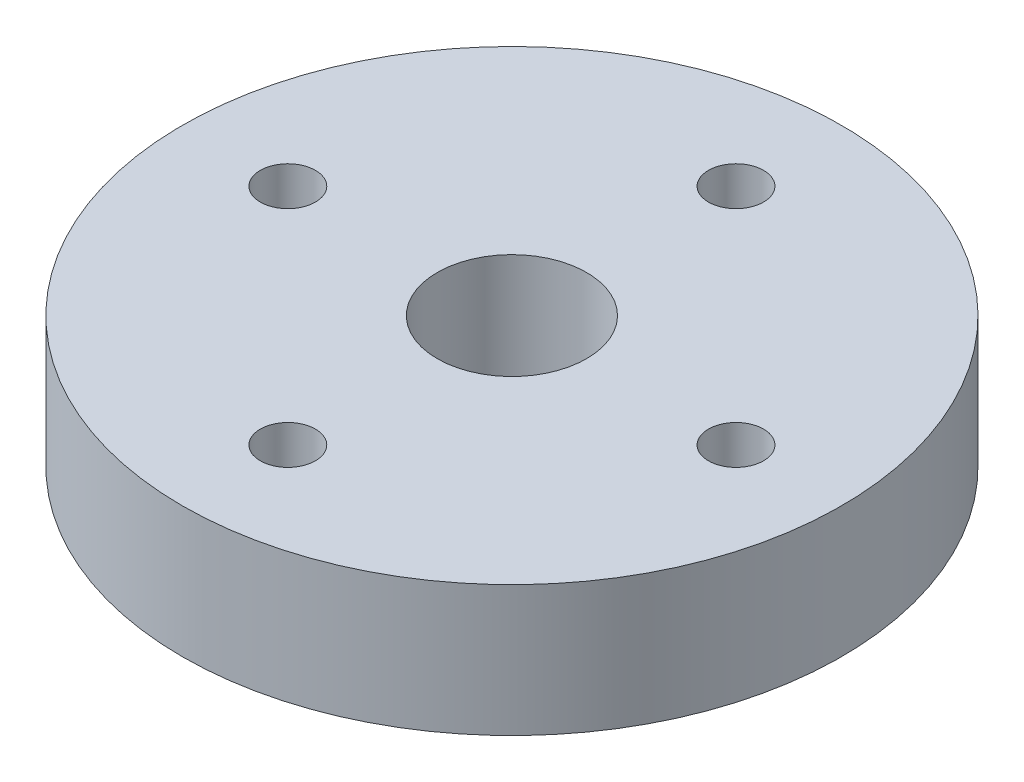
ISO-10303-21;
HEADER;
FILE_DESCRIPTION(('STEP AP214'),'2;1');
FILE_NAME('part.step','',(''),(''),'','','');
FILE_SCHEMA(('AUTOMOTIVE_DESIGN { 1 0 10303 214 1 1 1 1 }'));
ENDSEC;
DATA;
#1=APPLICATION_CONTEXT('core data for automotive mechanical design processes');
#2=APPLICATION_PROTOCOL_DEFINITION('international standard','automotive_design',2000,#1);
#3=PRODUCT_CONTEXT('',#1,'mechanical');
#4=PRODUCT('Part','Part','',(#3));
#5=PRODUCT_RELATED_PRODUCT_CATEGORY('part','',(#4));
#6=PRODUCT_DEFINITION_FORMATION('','',#4);
#7=PRODUCT_DEFINITION_CONTEXT('part definition',#1,'design');
#8=PRODUCT_DEFINITION('design','',#6,#7);
#9=PRODUCT_DEFINITION_SHAPE('','',#8);
#10=(LENGTH_UNIT() NAMED_UNIT(*) SI_UNIT(.MILLI.,.METRE.));
#11=(NAMED_UNIT(*) PLANE_ANGLE_UNIT() SI_UNIT($,.RADIAN.));
#12=(NAMED_UNIT(*) SI_UNIT($,.STERADIAN.) SOLID_ANGLE_UNIT());
#13=UNCERTAINTY_MEASURE_WITH_UNIT(LENGTH_MEASURE(1.E-05),#10,'distance_accuracy_value','');
#14=(GEOMETRIC_REPRESENTATION_CONTEXT(3) GLOBAL_UNCERTAINTY_ASSIGNED_CONTEXT((#13)) GLOBAL_UNIT_ASSIGNED_CONTEXT((#10,
#11,#12)) REPRESENTATION_CONTEXT('',''));
#15=CARTESIAN_POINT('',(0.,0.,0.));
#16=DIRECTION('',(0.,0.,1.));
#17=DIRECTION('',(1.,0.,0.));
#18=AXIS2_PLACEMENT_3D('',#15,#16,#17);
#19=CARTESIAN_POINT('',(0.,7.,0.));
#20=DIRECTION('',(0.,1.,0.));
#21=DIRECTION('',(0.,0.,1.));
#22=AXIS2_PLACEMENT_3D('',#19,#20,#21);
#23=PLANE('',#22);
#24=CARTESIAN_POINT('',(12.,7.,0.));
#25=DIRECTION('',(0.,1.,0.));
#26=DIRECTION('',(0.,0.,-1.));
#27=AXIS2_PLACEMENT_3D('',#24,#25,#26);
#28=CIRCLE('',#27,1.475);
#29=CARTESIAN_POINT('',(12.,7.,-1.475));
#30=VERTEX_POINT('',#29);
#31=EDGE_CURVE('E75',#30,#30,#28,.T.);
#32=ORIENTED_EDGE('',*,*,#31,.F.);
#33=EDGE_LOOP('',(#32));
#34=FACE_BOUND('',#33,.T.);
#35=CARTESIAN_POINT('',(0.,7.,-12.));
#36=DIRECTION('',(0.,1.,0.));
#37=DIRECTION('',(0.,0.,1.));
#38=AXIS2_PLACEMENT_3D('',#35,#36,#37);
#39=CIRCLE('',#38,1.475);
#40=CARTESIAN_POINT('',(0.,7.,-10.525));
#41=VERTEX_POINT('',#40);
#42=EDGE_CURVE('E68',#41,#41,#39,.T.);
#43=ORIENTED_EDGE('',*,*,#42,.F.);
#44=EDGE_LOOP('',(#43));
#45=FACE_BOUND('',#44,.T.);
#46=CARTESIAN_POINT('',(0.,7.,0.));
#47=DIRECTION('',(0.,1.,0.));
#48=DIRECTION('',(0.,0.,1.));
#49=AXIS2_PLACEMENT_3D('',#46,#47,#48);
#50=CIRCLE('',#49,17.65);
#51=CARTESIAN_POINT('',(0.,7.,17.65));
#52=VERTEX_POINT('',#51);
#53=EDGE_CURVE('E11',#52,#52,#50,.T.);
#54=ORIENTED_EDGE('',*,*,#53,.T.);
#55=EDGE_LOOP('',(#54));
#56=FACE_BOUND('',#55,.T.);
#57=CARTESIAN_POINT('',(0.,7.,0.));
#58=DIRECTION('',(0.,1.,0.));
#59=DIRECTION('',(0.,0.,1.));
#60=AXIS2_PLACEMENT_3D('',#57,#58,#59);
#61=CIRCLE('',#60,4.);
#62=CARTESIAN_POINT('',(0.,7.,4.));
#63=VERTEX_POINT('',#62);
#64=EDGE_CURVE('E52',#63,#63,#61,.T.);
#65=ORIENTED_EDGE('',*,*,#64,.F.);
#66=EDGE_LOOP('',(#65));
#67=FACE_BOUND('',#66,.T.);
#68=CARTESIAN_POINT('',(-12.,7.,0.));
#69=DIRECTION('',(0.,1.,0.));
#70=DIRECTION('',(0.,0.,1.));
#71=AXIS2_PLACEMENT_3D('',#68,#69,#70);
#72=CIRCLE('',#71,1.475);
#73=CARTESIAN_POINT('',(-12.,7.,1.475));
#74=VERTEX_POINT('',#73);
#75=EDGE_CURVE('E69',#74,#74,#72,.T.);
#76=ORIENTED_EDGE('',*,*,#75,.F.);
#77=EDGE_LOOP('',(#76));
#78=FACE_BOUND('',#77,.T.);
#79=CARTESIAN_POINT('',(0.,7.,12.));
#80=DIRECTION('',(0.,1.,0.));
#81=DIRECTION('',(0.,0.,-1.));
#82=AXIS2_PLACEMENT_3D('',#79,#80,#81);
#83=CIRCLE('',#82,1.475);
#84=CARTESIAN_POINT('',(0.,7.,10.525));
#85=VERTEX_POINT('',#84);
#86=EDGE_CURVE('E83',#85,#85,#83,.T.);
#87=ORIENTED_EDGE('',*,*,#86,.F.);
#88=EDGE_LOOP('',(#87));
#89=FACE_BOUND('',#88,.T.);
#90=ADVANCED_FACE('F38',(#34,#45,#56,#67,#78,#89),#23,.T.);
#91=CARTESIAN_POINT('',(0.,0.,0.));
#92=DIRECTION('',(0.,1.,0.));
#93=DIRECTION('',(0.,0.,1.));
#94=AXIS2_PLACEMENT_3D('',#91,#92,#93);
#95=PLANE('',#94);
#96=CARTESIAN_POINT('',(0.,0.,0.));
#97=DIRECTION('',(0.,1.,0.));
#98=DIRECTION('',(0.,0.,1.));
#99=AXIS2_PLACEMENT_3D('',#96,#97,#98);
#100=CIRCLE('',#99,17.65);
#101=CARTESIAN_POINT('',(0.,0.,17.65));
#102=VERTEX_POINT('',#101);
#103=EDGE_CURVE('E42',#102,#102,#100,.T.);
#104=ORIENTED_EDGE('',*,*,#103,.F.);
#105=EDGE_LOOP('',(#104));
#106=FACE_BOUND('',#105,.T.);
#107=CARTESIAN_POINT('',(0.,0.,0.));
#108=DIRECTION('',(0.,1.,0.));
#109=DIRECTION('',(0.,0.,1.));
#110=AXIS2_PLACEMENT_3D('',#107,#108,#109);
#111=CIRCLE('',#110,4.);
#112=CARTESIAN_POINT('',(0.,0.,4.));
#113=VERTEX_POINT('',#112);
#114=EDGE_CURVE('E55',#113,#113,#111,.T.);
#115=ORIENTED_EDGE('',*,*,#114,.T.);
#116=EDGE_LOOP('',(#115));
#117=FACE_BOUND('',#116,.T.);
#118=CARTESIAN_POINT('',(0.,0.,-12.));
#119=DIRECTION('',(0.,1.,0.));
#120=DIRECTION('',(0.,0.,1.));
#121=AXIS2_PLACEMENT_3D('',#118,#119,#120);
#122=CIRCLE('',#121,1.475);
#123=CARTESIAN_POINT('',(0.,0.,-10.525));
#124=VERTEX_POINT('',#123);
#125=EDGE_CURVE('E66',#124,#124,#122,.T.);
#126=ORIENTED_EDGE('',*,*,#125,.T.);
#127=EDGE_LOOP('',(#126));
#128=FACE_BOUND('',#127,.T.);
#129=CARTESIAN_POINT('',(-12.,0.,0.));
#130=DIRECTION('',(0.,1.,0.));
#131=DIRECTION('',(0.,0.,1.));
#132=AXIS2_PLACEMENT_3D('',#129,#130,#131);
#133=CIRCLE('',#132,1.475);
#134=CARTESIAN_POINT('',(-12.,0.,1.475));
#135=VERTEX_POINT('',#134);
#136=EDGE_CURVE('E73',#135,#135,#133,.T.);
#137=ORIENTED_EDGE('',*,*,#136,.T.);
#138=EDGE_LOOP('',(#137));
#139=FACE_BOUND('',#138,.T.);
#140=CARTESIAN_POINT('',(12.,0.,0.));
#141=DIRECTION('',(0.,1.,0.));
#142=DIRECTION('',(0.,0.,-1.));
#143=AXIS2_PLACEMENT_3D('',#140,#141,#142);
#144=CIRCLE('',#143,1.475);
#145=CARTESIAN_POINT('',(12.,0.,-1.475));
#146=VERTEX_POINT('',#145);
#147=EDGE_CURVE('E80',#146,#146,#144,.T.);
#148=ORIENTED_EDGE('',*,*,#147,.T.);
#149=EDGE_LOOP('',(#148));
#150=FACE_BOUND('',#149,.T.);
#151=CARTESIAN_POINT('',(0.,0.,12.));
#152=DIRECTION('',(0.,1.,0.));
#153=DIRECTION('',(0.,0.,-1.));
#154=AXIS2_PLACEMENT_3D('',#151,#152,#153);
#155=CIRCLE('',#154,1.475);
#156=CARTESIAN_POINT('',(0.,0.,10.525));
#157=VERTEX_POINT('',#156);
#158=EDGE_CURVE('E88',#157,#157,#155,.T.);
#159=ORIENTED_EDGE('',*,*,#158,.T.);
#160=EDGE_LOOP('',(#159));
#161=FACE_BOUND('',#160,.T.);
#162=ADVANCED_FACE('F99',(#106,#117,#128,#139,#150,#161),#95,.F.);
#163=CARTESIAN_POINT('',(0.,7.,0.));
#164=DIRECTION('',(0.,-1.,0.));
#165=DIRECTION('',(0.,0.,-1.));
#166=AXIS2_PLACEMENT_3D('',#163,#164,#165);
#167=CYLINDRICAL_SURFACE('',#166,17.65);
#168=ORIENTED_EDGE('',*,*,#53,.F.);
#169=EDGE_LOOP('',(#168));
#170=FACE_BOUND('',#169,.T.);
#171=ORIENTED_EDGE('',*,*,#103,.T.);
#172=EDGE_LOOP('',(#171));
#173=FACE_BOUND('',#172,.T.);
#174=ADVANCED_FACE('F40',(#170,#173),#167,.T.);
#175=CARTESIAN_POINT('',(0.,7.,0.));
#176=DIRECTION('',(0.,-1.,0.));
#177=DIRECTION('',(0.,0.,-1.));
#178=AXIS2_PLACEMENT_3D('',#175,#176,#177);
#179=CYLINDRICAL_SURFACE('',#178,4.);
#180=ORIENTED_EDGE('',*,*,#64,.T.);
#181=EDGE_LOOP('',(#180));
#182=FACE_BOUND('',#181,.T.);
#183=ORIENTED_EDGE('',*,*,#114,.F.);
#184=EDGE_LOOP('',(#183));
#185=FACE_BOUND('',#184,.T.);
#186=ADVANCED_FACE('F109',(#182,#185),#179,.F.);
#187=CARTESIAN_POINT('',(0.,7.,-12.));
#188=DIRECTION('',(0.,-1.,0.));
#189=DIRECTION('',(0.,0.,-1.));
#190=AXIS2_PLACEMENT_3D('',#187,#188,#189);
#191=CYLINDRICAL_SURFACE('',#190,1.475);
#192=ORIENTED_EDGE('',*,*,#42,.T.);
#193=EDGE_LOOP('',(#192));
#194=FACE_BOUND('',#193,.T.);
#195=ORIENTED_EDGE('',*,*,#125,.F.);
#196=EDGE_LOOP('',(#195));
#197=FACE_BOUND('',#196,.T.);
#198=ADVANCED_FACE('F112',(#194,#197),#191,.F.);
#199=CARTESIAN_POINT('',(-12.,7.,0.));
#200=DIRECTION('',(0.,-1.,0.));
#201=DIRECTION('',(0.,0.,-1.));
#202=AXIS2_PLACEMENT_3D('',#199,#200,#201);
#203=CYLINDRICAL_SURFACE('',#202,1.475);
#204=ORIENTED_EDGE('',*,*,#75,.T.);
#205=EDGE_LOOP('',(#204));
#206=FACE_BOUND('',#205,.T.);
#207=ORIENTED_EDGE('',*,*,#136,.F.);
#208=EDGE_LOOP('',(#207));
#209=FACE_BOUND('',#208,.T.);
#210=ADVANCED_FACE('F116',(#206,#209),#203,.F.);
#211=CARTESIAN_POINT('',(12.,7.,0.));
#212=DIRECTION('',(0.,-1.,0.));
#213=DIRECTION('',(0.,0.,-1.));
#214=AXIS2_PLACEMENT_3D('',#211,#212,#213);
#215=CYLINDRICAL_SURFACE('',#214,1.475);
#216=ORIENTED_EDGE('',*,*,#31,.T.);
#217=EDGE_LOOP('',(#216));
#218=FACE_BOUND('',#217,.T.);
#219=ORIENTED_EDGE('',*,*,#147,.F.);
#220=EDGE_LOOP('',(#219));
#221=FACE_BOUND('',#220,.T.);
#222=ADVANCED_FACE('F120',(#218,#221),#215,.F.);
#223=CARTESIAN_POINT('',(0.,7.,12.));
#224=DIRECTION('',(0.,-1.,0.));
#225=DIRECTION('',(0.,0.,-1.));
#226=AXIS2_PLACEMENT_3D('',#223,#224,#225);
#227=CYLINDRICAL_SURFACE('',#226,1.475);
#228=ORIENTED_EDGE('',*,*,#86,.T.);
#229=EDGE_LOOP('',(#228));
#230=FACE_BOUND('',#229,.T.);
#231=ORIENTED_EDGE('',*,*,#158,.F.);
#232=EDGE_LOOP('',(#231));
#233=FACE_BOUND('',#232,.T.);
#234=ADVANCED_FACE('F95',(#230,#233),#227,.F.);
#235=CLOSED_SHELL('',(#90,#162,#174,#186,#198,#210,#222,#234));
#236=MANIFOLD_SOLID_BREP('B2',#235);
#237=ADVANCED_BREP_SHAPE_REPRESENTATION('',(#18,#236),#14);
#238=SHAPE_DEFINITION_REPRESENTATION(#9,#237);
ENDSEC;
END-ISO-10303-21;
